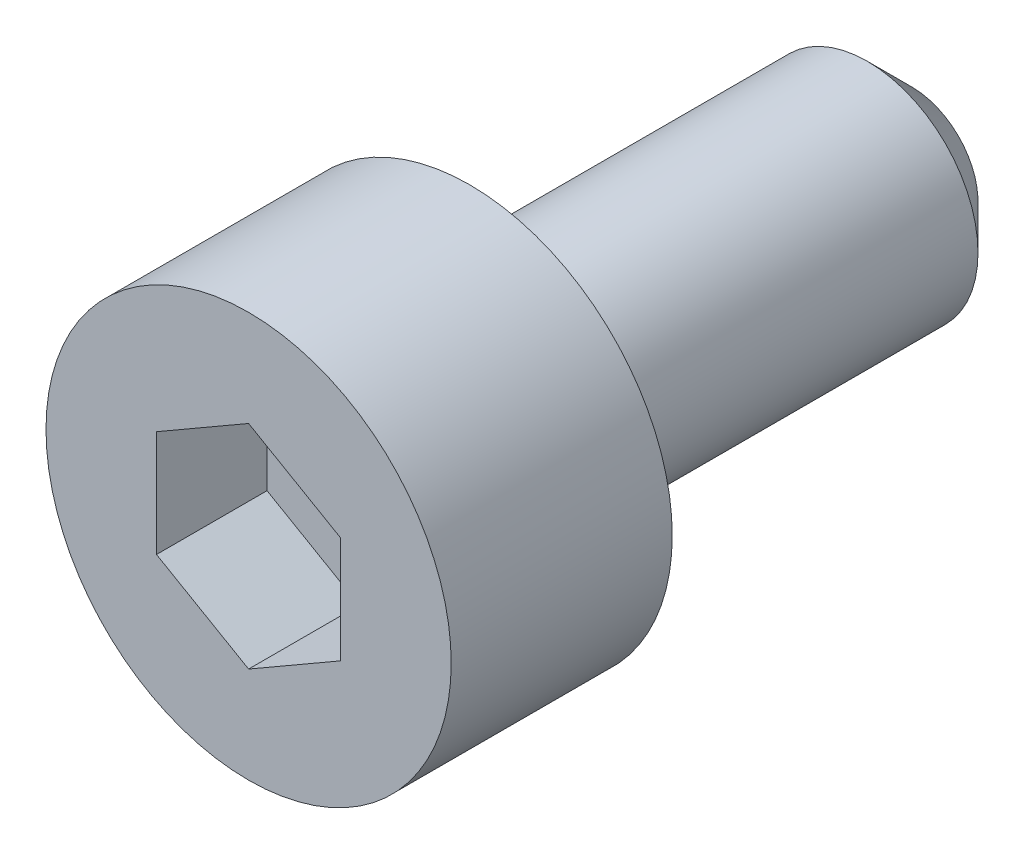
ISO-10303-21;
HEADER;
FILE_DESCRIPTION(('STEP AP214'),'2;1');
FILE_NAME('part.step','',(''),(''),'','','');
FILE_SCHEMA(('AUTOMOTIVE_DESIGN { 1 0 10303 214 1 1 1 1 }'));
ENDSEC;
DATA;
#1=APPLICATION_CONTEXT('core data for automotive mechanical design processes');
#2=APPLICATION_PROTOCOL_DEFINITION('international standard','automotive_design',2000,#1);
#3=PRODUCT_CONTEXT('',#1,'mechanical');
#4=PRODUCT('Part','Part','',(#3));
#5=PRODUCT_RELATED_PRODUCT_CATEGORY('part','',(#4));
#6=PRODUCT_DEFINITION_FORMATION('','',#4);
#7=PRODUCT_DEFINITION_CONTEXT('part definition',#1,'design');
#8=PRODUCT_DEFINITION('design','',#6,#7);
#9=PRODUCT_DEFINITION_SHAPE('','',#8);
#10=(LENGTH_UNIT() NAMED_UNIT(*) SI_UNIT(.MILLI.,.METRE.));
#11=(NAMED_UNIT(*) PLANE_ANGLE_UNIT() SI_UNIT($,.RADIAN.));
#12=(NAMED_UNIT(*) SI_UNIT($,.STERADIAN.) SOLID_ANGLE_UNIT());
#13=UNCERTAINTY_MEASURE_WITH_UNIT(LENGTH_MEASURE(1.E-05),#10,'distance_accuracy_value','');
#14=(GEOMETRIC_REPRESENTATION_CONTEXT(3) GLOBAL_UNCERTAINTY_ASSIGNED_CONTEXT((#13)) GLOBAL_UNIT_ASSIGNED_CONTEXT((#10,
#11,#12)) REPRESENTATION_CONTEXT('',''));
#15=CARTESIAN_POINT('',(0.,0.,0.));
#16=DIRECTION('',(0.,0.,1.));
#17=DIRECTION('',(1.,0.,0.));
#18=AXIS2_PLACEMENT_3D('',#15,#16,#17);
#19=CARTESIAN_POINT('',(0.,1.44337567297406,1.5));
#20=DIRECTION('',(-0.5,-0.86602540378444,0.));
#21=DIRECTION('',(0.86602540378444,-0.5,0.));
#22=AXIS2_PLACEMENT_3D('',#19,#20,#21);
#23=PLANE('',#22);
#24=DIRECTION('',(0.,0.,1.));
#25=VECTOR('',#24,1.);
#26=CARTESIAN_POINT('',(1.25,0.721687836487034,1.5));
#27=LINE('',#26,#25);
#28=CARTESIAN_POINT('',(1.25,0.721687836487034,1.5));
#29=VERTEX_POINT('',#28);
#30=CARTESIAN_POINT('',(1.25,0.721687836487034,3.));
#31=VERTEX_POINT('',#30);
#32=EDGE_CURVE('E63',#29,#31,#27,.T.);
#33=ORIENTED_EDGE('',*,*,#32,.T.);
#34=DIRECTION('',(0.866025403784439,-0.5,0.));
#35=VECTOR('',#34,1.);
#36=CARTESIAN_POINT('',(0.,1.44337567297406,3.));
#37=LINE('',#36,#35);
#38=CARTESIAN_POINT('',(0.,1.44337567297406,3.));
#39=VERTEX_POINT('',#38);
#40=EDGE_CURVE('E29',#39,#31,#37,.T.);
#41=ORIENTED_EDGE('',*,*,#40,.F.);
#42=DIRECTION('',(0.,0.,1.));
#43=VECTOR('',#42,1.);
#44=CARTESIAN_POINT('',(0.,1.44337567297406,1.5));
#45=LINE('',#44,#43);
#46=CARTESIAN_POINT('',(0.,1.44337567297406,1.5));
#47=VERTEX_POINT('',#46);
#48=EDGE_CURVE('E33',#47,#39,#45,.T.);
#49=ORIENTED_EDGE('',*,*,#48,.F.);
#50=DIRECTION('',(0.866025403784439,-0.5,0.));
#51=VECTOR('',#50,1.);
#52=CARTESIAN_POINT('',(0.,1.44337567297406,1.5));
#53=LINE('',#52,#51);
#54=EDGE_CURVE('E65',#47,#29,#53,.T.);
#55=ORIENTED_EDGE('',*,*,#54,.T.);
#56=EDGE_LOOP('',(#33,#41,#49,#55));
#57=FACE_BOUND('',#56,.T.);
#58=ADVANCED_FACE('F14',(#57),#23,.T.);
#59=CARTESIAN_POINT('',(1.25,-0.721687836487035,1.5));
#60=DIRECTION('',(1.,0.,0.));
#61=DIRECTION('',(0.,1.,0.));
#62=AXIS2_PLACEMENT_3D('',#59,#60,#61);
#63=PLANE('',#62);
#64=DIRECTION('',(0.,0.,1.));
#65=VECTOR('',#64,1.);
#66=CARTESIAN_POINT('',(1.25,-0.721687836487035,1.5));
#67=LINE('',#66,#65);
#68=CARTESIAN_POINT('',(1.25,-0.721687836487035,1.5));
#69=VERTEX_POINT('',#68);
#70=CARTESIAN_POINT('',(1.25,-0.721687836487035,3.));
#71=VERTEX_POINT('',#70);
#72=EDGE_CURVE('E70',#69,#71,#67,.T.);
#73=ORIENTED_EDGE('',*,*,#72,.T.);
#74=DIRECTION('',(0.,1.,0.));
#75=VECTOR('',#74,1.);
#76=CARTESIAN_POINT('',(1.25,-0.721687836487035,3.));
#77=LINE('',#76,#75);
#78=EDGE_CURVE('E73',#71,#31,#77,.T.);
#79=ORIENTED_EDGE('',*,*,#78,.T.);
#80=ORIENTED_EDGE('',*,*,#32,.F.);
#81=DIRECTION('',(0.,1.,0.));
#82=VECTOR('',#81,1.);
#83=CARTESIAN_POINT('',(1.25,-0.721687836487035,1.5));
#84=LINE('',#83,#82);
#85=EDGE_CURVE('E100',#69,#29,#84,.T.);
#86=ORIENTED_EDGE('',*,*,#85,.F.);
#87=EDGE_LOOP('',(#73,#79,#80,#86));
#88=FACE_BOUND('',#87,.T.);
#89=ADVANCED_FACE('F74',(#88),#63,.F.);
#90=CARTESIAN_POINT('',(0.,-1.44337567297406,1.5));
#91=DIRECTION('',(0.5,-0.86602540378444,0.));
#92=DIRECTION('',(0.86602540378444,0.5,0.));
#93=AXIS2_PLACEMENT_3D('',#90,#91,#92);
#94=PLANE('',#93);
#95=DIRECTION('',(0.,0.,1.));
#96=VECTOR('',#95,1.);
#97=CARTESIAN_POINT('',(0.,-1.44337567297406,1.5));
#98=LINE('',#97,#96);
#99=CARTESIAN_POINT('',(0.,-1.44337567297406,1.5));
#100=VERTEX_POINT('',#99);
#101=CARTESIAN_POINT('',(0.,-1.44337567297406,3.));
#102=VERTEX_POINT('',#101);
#103=EDGE_CURVE('E108',#100,#102,#98,.T.);
#104=ORIENTED_EDGE('',*,*,#103,.T.);
#105=DIRECTION('',(0.86602540378444,0.5,0.));
#106=VECTOR('',#105,1.);
#107=CARTESIAN_POINT('',(0.,-1.44337567297406,3.));
#108=LINE('',#107,#106);
#109=EDGE_CURVE('E78',#102,#71,#108,.T.);
#110=ORIENTED_EDGE('',*,*,#109,.T.);
#111=ORIENTED_EDGE('',*,*,#72,.F.);
#112=DIRECTION('',(0.86602540378444,0.5,0.));
#113=VECTOR('',#112,1.);
#114=CARTESIAN_POINT('',(0.,-1.44337567297406,1.5));
#115=LINE('',#114,#113);
#116=EDGE_CURVE('E97',#100,#69,#115,.T.);
#117=ORIENTED_EDGE('',*,*,#116,.F.);
#118=EDGE_LOOP('',(#104,#110,#111,#117));
#119=FACE_BOUND('',#118,.T.);
#120=ADVANCED_FACE('F141',(#119),#94,.F.);
#121=CARTESIAN_POINT('',(0.,-1.44337567297406,1.5));
#122=DIRECTION('',(0.5,0.86602540378444,0.));
#123=DIRECTION('',(-0.86602540378444,0.5,0.));
#124=AXIS2_PLACEMENT_3D('',#121,#122,#123);
#125=PLANE('',#124);
#126=DIRECTION('',(0.,0.,1.));
#127=VECTOR('',#126,1.);
#128=CARTESIAN_POINT('',(-1.25,-0.721687836487034,1.5));
#129=LINE('',#128,#127);
#130=CARTESIAN_POINT('',(-1.25,-0.721687836487034,1.5));
#131=VERTEX_POINT('',#130);
#132=CARTESIAN_POINT('',(-1.25,-0.721687836487034,3.));
#133=VERTEX_POINT('',#132);
#134=EDGE_CURVE('E106',#131,#133,#129,.T.);
#135=ORIENTED_EDGE('',*,*,#134,.T.);
#136=DIRECTION('',(-0.86602540378444,0.5,0.));
#137=VECTOR('',#136,1.);
#138=CARTESIAN_POINT('',(0.,-1.44337567297406,3.));
#139=LINE('',#138,#137);
#140=EDGE_CURVE('E189',#102,#133,#139,.T.);
#141=ORIENTED_EDGE('',*,*,#140,.F.);
#142=ORIENTED_EDGE('',*,*,#103,.F.);
#143=DIRECTION('',(-0.86602540378444,0.5,0.));
#144=VECTOR('',#143,1.);
#145=CARTESIAN_POINT('',(0.,-1.44337567297406,1.5));
#146=LINE('',#145,#144);
#147=EDGE_CURVE('E94',#100,#131,#146,.T.);
#148=ORIENTED_EDGE('',*,*,#147,.T.);
#149=EDGE_LOOP('',(#135,#141,#142,#148));
#150=FACE_BOUND('',#149,.T.);
#151=ADVANCED_FACE('F153',(#150),#125,.T.);
#152=CARTESIAN_POINT('',(-1.25,0.721687836487033,1.5));
#153=DIRECTION('',(-1.,0.,0.));
#154=DIRECTION('',(0.,-1.,0.));
#155=AXIS2_PLACEMENT_3D('',#152,#153,#154);
#156=PLANE('',#155);
#157=DIRECTION('',(0.,0.,1.));
#158=VECTOR('',#157,1.);
#159=CARTESIAN_POINT('',(-1.25,0.721687836487033,1.5));
#160=LINE('',#159,#158);
#161=CARTESIAN_POINT('',(-1.25,0.721687836487033,1.5));
#162=VERTEX_POINT('',#161);
#163=CARTESIAN_POINT('',(-1.25,0.721687836487033,3.));
#164=VERTEX_POINT('',#163);
#165=EDGE_CURVE('E104',#162,#164,#160,.T.);
#166=ORIENTED_EDGE('',*,*,#165,.T.);
#167=DIRECTION('',(0.,-1.,0.));
#168=VECTOR('',#167,1.);
#169=CARTESIAN_POINT('',(-1.25,0.721687836487033,3.));
#170=LINE('',#169,#168);
#171=EDGE_CURVE('E190',#164,#133,#170,.T.);
#172=ORIENTED_EDGE('',*,*,#171,.T.);
#173=ORIENTED_EDGE('',*,*,#134,.F.);
#174=DIRECTION('',(0.,-1.,0.));
#175=VECTOR('',#174,1.);
#176=CARTESIAN_POINT('',(-1.25,0.721687836487033,1.5));
#177=LINE('',#176,#175);
#178=EDGE_CURVE('E91',#162,#131,#177,.T.);
#179=ORIENTED_EDGE('',*,*,#178,.F.);
#180=EDGE_LOOP('',(#166,#172,#173,#179));
#181=FACE_BOUND('',#180,.T.);
#182=ADVANCED_FACE('F149',(#181),#156,.F.);
#183=CARTESIAN_POINT('',(0.,1.44337567297406,1.5));
#184=DIRECTION('',(-0.5,0.86602540378444,0.));
#185=DIRECTION('',(-0.86602540378444,-0.5,0.));
#186=AXIS2_PLACEMENT_3D('',#183,#184,#185);
#187=PLANE('',#186);
#188=DIRECTION('',(-0.86602540378444,-0.5,0.));
#189=VECTOR('',#188,1.);
#190=CARTESIAN_POINT('',(0.,1.44337567297406,1.5));
#191=LINE('',#190,#189);
#192=EDGE_CURVE('E88',#47,#162,#191,.T.);
#193=ORIENTED_EDGE('',*,*,#192,.F.);
#194=ORIENTED_EDGE('',*,*,#48,.T.);
#195=DIRECTION('',(-0.86602540378444,-0.5,0.));
#196=VECTOR('',#195,1.);
#197=CARTESIAN_POINT('',(0.,1.44337567297406,3.));
#198=LINE('',#197,#196);
#199=EDGE_CURVE('E84',#39,#164,#198,.T.);
#200=ORIENTED_EDGE('',*,*,#199,.T.);
#201=ORIENTED_EDGE('',*,*,#165,.F.);
#202=EDGE_LOOP('',(#193,#194,#200,#201));
#203=FACE_BOUND('',#202,.T.);
#204=ADVANCED_FACE('F146',(#203),#187,.F.);
#205=CARTESIAN_POINT('',(1.25,0.721687836487033,1.5));
#206=DIRECTION('',(0.,0.,1.));
#207=DIRECTION('',(1.,0.,0.));
#208=AXIS2_PLACEMENT_3D('',#205,#206,#207);
#209=PLANE('',#208);
#210=ORIENTED_EDGE('',*,*,#54,.F.);
#211=ORIENTED_EDGE('',*,*,#192,.T.);
#212=ORIENTED_EDGE('',*,*,#178,.T.);
#213=ORIENTED_EDGE('',*,*,#147,.F.);
#214=ORIENTED_EDGE('',*,*,#116,.T.);
#215=ORIENTED_EDGE('',*,*,#85,.T.);
#216=EDGE_LOOP('',(#210,#211,#212,#213,#214,#215));
#217=FACE_BOUND('',#216,.T.);
#218=ADVANCED_FACE('F145',(#217),#209,.T.);
#219=CARTESIAN_POINT('',(0.,0.,3.));
#220=DIRECTION('',(0.,0.,1.));
#221=DIRECTION('',(1.,0.,0.));
#222=AXIS2_PLACEMENT_3D('',#219,#220,#221);
#223=PLANE('',#222);
#224=CARTESIAN_POINT('',(0.,0.,3.));
#225=DIRECTION('',(0.,0.,1.));
#226=DIRECTION('',(1.,0.,0.));
#227=AXIS2_PLACEMENT_3D('',#224,#225,#226);
#228=CIRCLE('',#227,2.75);
#229=CARTESIAN_POINT('',(2.75,0.,3.));
#230=VERTEX_POINT('',#229);
#231=EDGE_CURVE('E116',#230,#230,#228,.T.);
#232=ORIENTED_EDGE('',*,*,#231,.T.);
#233=EDGE_LOOP('',(#232));
#234=FACE_BOUND('',#233,.T.);
#235=ORIENTED_EDGE('',*,*,#199,.F.);
#236=ORIENTED_EDGE('',*,*,#40,.T.);
#237=ORIENTED_EDGE('',*,*,#78,.F.);
#238=ORIENTED_EDGE('',*,*,#109,.F.);
#239=ORIENTED_EDGE('',*,*,#140,.T.);
#240=ORIENTED_EDGE('',*,*,#171,.F.);
#241=EDGE_LOOP('',(#235,#236,#237,#238,#239,#240));
#242=FACE_BOUND('',#241,.T.);
#243=ADVANCED_FACE('F81',(#234,#242),#223,.T.);
#244=CARTESIAN_POINT('',(0.,0.,14.));
#245=DIRECTION('',(0.,0.,1.));
#246=DIRECTION('',(1.,0.,0.));
#247=AXIS2_PLACEMENT_3D('',#244,#245,#246);
#248=CYLINDRICAL_SURFACE('',#247,2.75);
#249=CARTESIAN_POINT('',(0.,0.,0.));
#250=DIRECTION('',(0.,0.,1.));
#251=DIRECTION('',(1.,0.,0.));
#252=AXIS2_PLACEMENT_3D('',#249,#250,#251);
#253=CIRCLE('',#252,2.75);
#254=CARTESIAN_POINT('',(2.75,0.,0.));
#255=VERTEX_POINT('',#254);
#256=EDGE_CURVE('E113',#255,#255,#253,.T.);
#257=ORIENTED_EDGE('',*,*,#256,.T.);
#258=EDGE_LOOP('',(#257));
#259=FACE_BOUND('',#258,.T.);
#260=ORIENTED_EDGE('',*,*,#231,.F.);
#261=EDGE_LOOP('',(#260));
#262=FACE_BOUND('',#261,.T.);
#263=ADVANCED_FACE('F166',(#259,#262),#248,.T.);
#264=CARTESIAN_POINT('',(2.75,0.,0.));
#265=DIRECTION('',(0.,0.,-1.));
#266=DIRECTION('',(-1.,0.,0.));
#267=AXIS2_PLACEMENT_3D('',#264,#265,#266);
#268=PLANE('',#267);
#269=CARTESIAN_POINT('',(0.,0.,0.));
#270=DIRECTION('',(0.,0.,1.));
#271=DIRECTION('',(1.,0.,0.));
#272=AXIS2_PLACEMENT_3D('',#269,#270,#271);
#273=CIRCLE('',#272,1.5);
#274=CARTESIAN_POINT('',(1.5,0.,0.));
#275=VERTEX_POINT('',#274);
#276=EDGE_CURVE('E69',#275,#275,#273,.T.);
#277=ORIENTED_EDGE('',*,*,#276,.T.);
#278=EDGE_LOOP('',(#277));
#279=FACE_BOUND('',#278,.T.);
#280=ORIENTED_EDGE('',*,*,#256,.F.);
#281=EDGE_LOOP('',(#280));
#282=FACE_BOUND('',#281,.T.);
#283=ADVANCED_FACE('F163',(#279,#282),#268,.T.);
#284=CARTESIAN_POINT('',(0.,0.,14.));
#285=DIRECTION('',(0.,0.,1.));
#286=DIRECTION('',(1.,0.,0.));
#287=AXIS2_PLACEMENT_3D('',#284,#285,#286);
#288=CYLINDRICAL_SURFACE('',#287,1.5);
#289=CARTESIAN_POINT('',(0.,0.,-5.4));
#290=DIRECTION('',(0.,0.,-1.));
#291=DIRECTION('',(-1.,0.,0.));
#292=AXIS2_PLACEMENT_3D('',#289,#290,#291);
#293=CIRCLE('',#292,1.5);
#294=CARTESIAN_POINT('',(-1.5,0.,-5.4));
#295=VERTEX_POINT('',#294);
#296=EDGE_CURVE('E22',#295,#295,#293,.F.);
#297=ORIENTED_EDGE('',*,*,#296,.T.);
#298=EDGE_LOOP('',(#297));
#299=FACE_BOUND('',#298,.T.);
#300=ORIENTED_EDGE('',*,*,#276,.F.);
#301=EDGE_LOOP('',(#300));
#302=FACE_BOUND('',#301,.T.);
#303=ADVANCED_FACE('F121',(#299,#302),#288,.T.);
#304=CARTESIAN_POINT('',(1.5,0.,-6.));
#305=DIRECTION('',(0.,0.,-1.));
#306=DIRECTION('',(-1.,0.,0.));
#307=AXIS2_PLACEMENT_3D('',#304,#305,#306);
#308=PLANE('',#307);
#309=CARTESIAN_POINT('',(0.,0.,-6.));
#310=DIRECTION('',(0.,0.,-1.));
#311=DIRECTION('',(-1.,0.,0.));
#312=AXIS2_PLACEMENT_3D('',#309,#310,#311);
#313=CIRCLE('',#312,0.9);
#314=CARTESIAN_POINT('',(-0.9,0.,-6.));
#315=VERTEX_POINT('',#314);
#316=EDGE_CURVE('E9',#315,#315,#313,.T.);
#317=ORIENTED_EDGE('',*,*,#316,.T.);
#318=EDGE_LOOP('',(#317));
#319=FACE_BOUND('',#318,.T.);
#320=ADVANCED_FACE('F125',(#319),#308,.T.);
#321=CARTESIAN_POINT('',(0.,0.,-5.4));
#322=DIRECTION('',(0.,0.,1.));
#323=DIRECTION('',(1.,0.,0.));
#324=AXIS2_PLACEMENT_3D('',#321,#322,#323);
#325=CONICAL_SURFACE('',#324,1.5,0.785398163397448);
#326=ORIENTED_EDGE('',*,*,#316,.F.);
#327=EDGE_LOOP('',(#326));
#328=FACE_BOUND('',#327,.T.);
#329=ORIENTED_EDGE('',*,*,#296,.F.);
#330=EDGE_LOOP('',(#329));
#331=FACE_BOUND('',#330,.T.);
#332=ADVANCED_FACE('F16',(#328,#331),#325,.T.);
#333=CLOSED_SHELL('',(#58,#89,#120,#151,#182,#204,#218,#243,#263,#283,#303,#320,#332));
#334=MANIFOLD_SOLID_BREP('B1',#333);
#335=ADVANCED_BREP_SHAPE_REPRESENTATION('',(#18,#334),#14);
#336=SHAPE_DEFINITION_REPRESENTATION(#9,#335);
ENDSEC;
END-ISO-10303-21;
